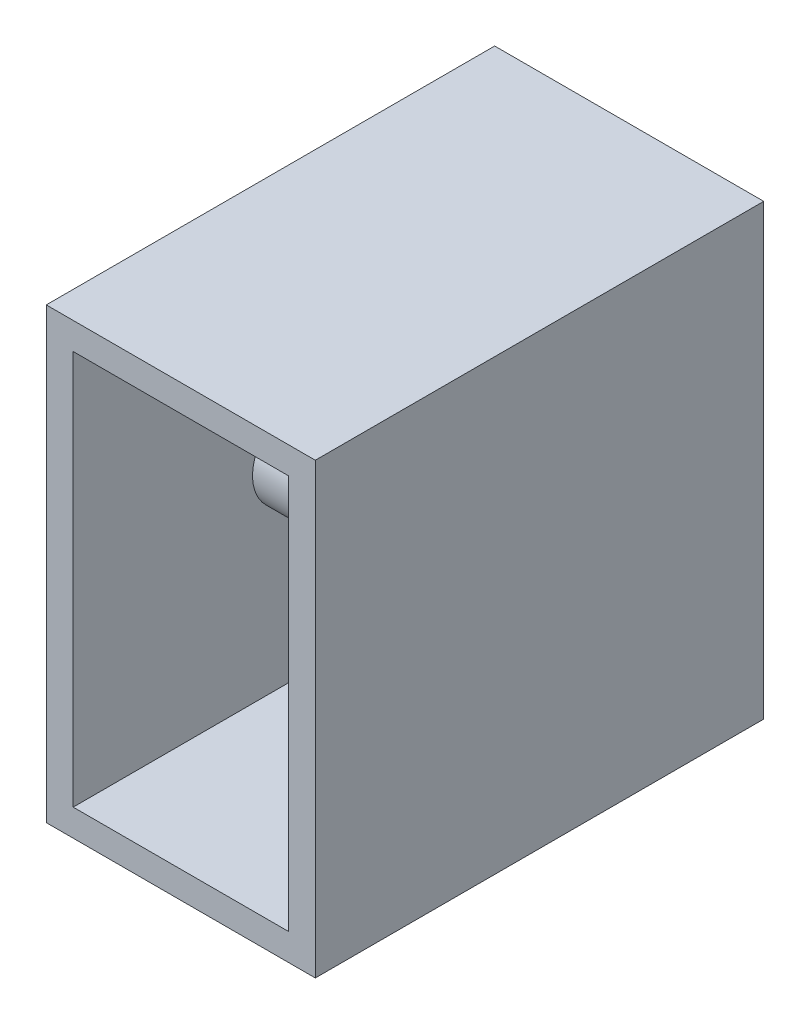
ISO-10303-21;
HEADER;
FILE_DESCRIPTION(('STEP AP214'),'2;1');
FILE_NAME('part.step','',(''),(''),'','','');
FILE_SCHEMA(('AUTOMOTIVE_DESIGN { 1 0 10303 214 1 1 1 1 }'));
ENDSEC;
DATA;
#1=APPLICATION_CONTEXT('core data for automotive mechanical design processes');
#2=APPLICATION_PROTOCOL_DEFINITION('international standard','automotive_design',2000,#1);
#3=PRODUCT_CONTEXT('',#1,'mechanical');
#4=PRODUCT('Part','Part','',(#3));
#5=PRODUCT_RELATED_PRODUCT_CATEGORY('part','',(#4));
#6=PRODUCT_DEFINITION_FORMATION('','',#4);
#7=PRODUCT_DEFINITION_CONTEXT('part definition',#1,'design');
#8=PRODUCT_DEFINITION('design','',#6,#7);
#9=PRODUCT_DEFINITION_SHAPE('','',#8);
#10=(LENGTH_UNIT() NAMED_UNIT(*) SI_UNIT(.MILLI.,.METRE.));
#11=(NAMED_UNIT(*) PLANE_ANGLE_UNIT() SI_UNIT($,.RADIAN.));
#12=(NAMED_UNIT(*) SI_UNIT($,.STERADIAN.) SOLID_ANGLE_UNIT());
#13=UNCERTAINTY_MEASURE_WITH_UNIT(LENGTH_MEASURE(1.E-05),#10,'distance_accuracy_value','');
#14=(GEOMETRIC_REPRESENTATION_CONTEXT(3) GLOBAL_UNCERTAINTY_ASSIGNED_CONTEXT((#13)) GLOBAL_UNIT_ASSIGNED_CONTEXT((#10,
#11,#12)) REPRESENTATION_CONTEXT('',''));
#15=CARTESIAN_POINT('',(0.,0.,0.));
#16=DIRECTION('',(0.,0.,1.));
#17=DIRECTION('',(1.,0.,0.));
#18=AXIS2_PLACEMENT_3D('',#15,#16,#17);
#19=CARTESIAN_POINT('',(0.,0.,50.));
#20=DIRECTION('',(0.,0.,1.));
#21=DIRECTION('',(1.,0.,0.));
#22=AXIS2_PLACEMENT_3D('',#19,#20,#21);
#23=PLANE('',#22);
#24=DIRECTION('',(0.,-1.,0.));
#25=VECTOR('',#24,1.);
#26=CARTESIAN_POINT('',(0.,0.,50.));
#27=LINE('',#26,#25);
#28=CARTESIAN_POINT('',(0.,50.,50.));
#29=VERTEX_POINT('',#28);
#30=CARTESIAN_POINT('',(0.,0.,50.));
#31=VERTEX_POINT('',#30);
#32=EDGE_CURVE('E182',#29,#31,#27,.T.);
#33=ORIENTED_EDGE('',*,*,#32,.T.);
#34=DIRECTION('',(1.,0.,0.));
#35=VECTOR('',#34,1.);
#36=CARTESIAN_POINT('',(0.,0.,50.));
#37=LINE('',#36,#35);
#38=CARTESIAN_POINT('',(30.,0.,50.));
#39=VERTEX_POINT('',#38);
#40=EDGE_CURVE('E186',#31,#39,#37,.T.);
#41=ORIENTED_EDGE('',*,*,#40,.T.);
#42=DIRECTION('',(0.,1.,0.));
#43=VECTOR('',#42,1.);
#44=CARTESIAN_POINT('',(30.,0.,50.));
#45=LINE('',#44,#43);
#46=CARTESIAN_POINT('',(30.,50.,50.));
#47=VERTEX_POINT('',#46);
#48=EDGE_CURVE('E190',#39,#47,#45,.T.);
#49=ORIENTED_EDGE('',*,*,#48,.T.);
#50=DIRECTION('',(-1.,0.,0.));
#51=VECTOR('',#50,1.);
#52=CARTESIAN_POINT('',(0.,50.,50.));
#53=LINE('',#52,#51);
#54=EDGE_CURVE('E193',#47,#29,#53,.T.);
#55=ORIENTED_EDGE('',*,*,#54,.T.);
#56=EDGE_LOOP('',(#33,#41,#49,#55));
#57=FACE_BOUND('',#56,.T.);
#58=DIRECTION('',(1.,0.,0.));
#59=VECTOR('',#58,1.);
#60=CARTESIAN_POINT('',(0.,3.,50.));
#61=LINE('',#60,#59);
#62=CARTESIAN_POINT('',(3.,3.,50.));
#63=VERTEX_POINT('',#62);
#64=CARTESIAN_POINT('',(27.,3.,50.));
#65=VERTEX_POINT('',#64);
#66=EDGE_CURVE('E143',#63,#65,#61,.T.);
#67=ORIENTED_EDGE('',*,*,#66,.F.);
#68=DIRECTION('',(0.,-1.,0.));
#69=VECTOR('',#68,1.);
#70=CARTESIAN_POINT('',(3.,0.,50.));
#71=LINE('',#70,#69);
#72=CARTESIAN_POINT('',(3.,47.,50.));
#73=VERTEX_POINT('',#72);
#74=EDGE_CURVE('E134',#73,#63,#71,.T.);
#75=ORIENTED_EDGE('',*,*,#74,.F.);
#76=DIRECTION('',(-1.,0.,0.));
#77=VECTOR('',#76,1.);
#78=CARTESIAN_POINT('',(0.,47.,50.));
#79=LINE('',#78,#77);
#80=CARTESIAN_POINT('',(27.,47.,50.));
#81=VERTEX_POINT('',#80);
#82=EDGE_CURVE('E160',#81,#73,#79,.T.);
#83=ORIENTED_EDGE('',*,*,#82,.F.);
#84=DIRECTION('',(0.,1.,0.));
#85=VECTOR('',#84,1.);
#86=CARTESIAN_POINT('',(27.,0.,50.));
#87=LINE('',#86,#85);
#88=EDGE_CURVE('E156',#65,#81,#87,.T.);
#89=ORIENTED_EDGE('',*,*,#88,.F.);
#90=EDGE_LOOP('',(#67,#75,#83,#89));
#91=FACE_BOUND('',#90,.T.);
#92=ADVANCED_FACE('F67',(#57,#91),#23,.T.);
#93=CARTESIAN_POINT('',(0.,0.,0.));
#94=DIRECTION('',(0.,0.,1.));
#95=DIRECTION('',(1.,0.,0.));
#96=AXIS2_PLACEMENT_3D('',#93,#94,#95);
#97=PLANE('',#96);
#98=DIRECTION('',(0.,-1.,0.));
#99=VECTOR('',#98,1.);
#100=CARTESIAN_POINT('',(0.,0.,0.));
#101=LINE('',#100,#99);
#102=CARTESIAN_POINT('',(0.,50.,0.));
#103=VERTEX_POINT('',#102);
#104=CARTESIAN_POINT('',(0.,0.,0.));
#105=VERTEX_POINT('',#104);
#106=EDGE_CURVE('E152',#103,#105,#101,.T.);
#107=ORIENTED_EDGE('',*,*,#106,.F.);
#108=DIRECTION('',(-1.,0.,0.));
#109=VECTOR('',#108,1.);
#110=CARTESIAN_POINT('',(0.,50.,0.));
#111=LINE('',#110,#109);
#112=CARTESIAN_POINT('',(30.,50.,0.));
#113=VERTEX_POINT('',#112);
#114=EDGE_CURVE('E187',#113,#103,#111,.T.);
#115=ORIENTED_EDGE('',*,*,#114,.F.);
#116=DIRECTION('',(0.,1.,0.));
#117=VECTOR('',#116,1.);
#118=CARTESIAN_POINT('',(30.,0.,0.));
#119=LINE('',#118,#117);
#120=CARTESIAN_POINT('',(30.,0.,0.));
#121=VERTEX_POINT('',#120);
#122=EDGE_CURVE('E203',#121,#113,#119,.T.);
#123=ORIENTED_EDGE('',*,*,#122,.F.);
#124=DIRECTION('',(1.,0.,0.));
#125=VECTOR('',#124,1.);
#126=CARTESIAN_POINT('',(0.,0.,0.));
#127=LINE('',#126,#125);
#128=EDGE_CURVE('E200',#105,#121,#127,.T.);
#129=ORIENTED_EDGE('',*,*,#128,.F.);
#130=EDGE_LOOP('',(#107,#115,#123,#129));
#131=FACE_BOUND('',#130,.T.);
#132=DIRECTION('',(0.,-1.,0.));
#133=VECTOR('',#132,1.);
#134=CARTESIAN_POINT('',(3.,0.,0.));
#135=LINE('',#134,#133);
#136=CARTESIAN_POINT('',(3.,47.,0.));
#137=VERTEX_POINT('',#136);
#138=CARTESIAN_POINT('',(3.,3.,0.));
#139=VERTEX_POINT('',#138);
#140=EDGE_CURVE('E92',#137,#139,#135,.T.);
#141=ORIENTED_EDGE('',*,*,#140,.T.);
#142=DIRECTION('',(1.,0.,0.));
#143=VECTOR('',#142,1.);
#144=CARTESIAN_POINT('',(0.,3.,0.));
#145=LINE('',#144,#143);
#146=CARTESIAN_POINT('',(27.,3.,0.));
#147=VERTEX_POINT('',#146);
#148=EDGE_CURVE('E150',#139,#147,#145,.T.);
#149=ORIENTED_EDGE('',*,*,#148,.T.);
#150=DIRECTION('',(0.,1.,0.));
#151=VECTOR('',#150,1.);
#152=CARTESIAN_POINT('',(27.,0.,0.));
#153=LINE('',#152,#151);
#154=CARTESIAN_POINT('',(27.,47.,0.));
#155=VERTEX_POINT('',#154);
#156=EDGE_CURVE('E169',#147,#155,#153,.T.);
#157=ORIENTED_EDGE('',*,*,#156,.T.);
#158=DIRECTION('',(-1.,0.,0.));
#159=VECTOR('',#158,1.);
#160=CARTESIAN_POINT('',(0.,47.,0.));
#161=LINE('',#160,#159);
#162=EDGE_CURVE('E144',#155,#137,#161,.T.);
#163=ORIENTED_EDGE('',*,*,#162,.T.);
#164=EDGE_LOOP('',(#141,#149,#157,#163));
#165=FACE_BOUND('',#164,.T.);
#166=ADVANCED_FACE('F236',(#131,#165),#97,.F.);
#167=CARTESIAN_POINT('',(0.,0.,50.));
#168=DIRECTION('',(1.,0.,0.));
#169=DIRECTION('',(0.,0.,-1.));
#170=AXIS2_PLACEMENT_3D('',#167,#168,#169);
#171=PLANE('',#170);
#172=ORIENTED_EDGE('',*,*,#106,.T.);
#173=DIRECTION('',(0.,0.,-1.));
#174=VECTOR('',#173,1.);
#175=CARTESIAN_POINT('',(0.,0.,50.));
#176=LINE('',#175,#174);
#177=EDGE_CURVE('E218',#31,#105,#176,.T.);
#178=ORIENTED_EDGE('',*,*,#177,.F.);
#179=ORIENTED_EDGE('',*,*,#32,.F.);
#180=DIRECTION('',(0.,0.,-1.));
#181=VECTOR('',#180,1.);
#182=CARTESIAN_POINT('',(0.,50.,50.));
#183=LINE('',#182,#181);
#184=EDGE_CURVE('E196',#29,#103,#183,.T.);
#185=ORIENTED_EDGE('',*,*,#184,.T.);
#186=EDGE_LOOP('',(#172,#178,#179,#185));
#187=FACE_BOUND('',#186,.T.);
#188=ADVANCED_FACE('F69',(#187),#171,.F.);
#189=CARTESIAN_POINT('',(0.,0.,50.));
#190=DIRECTION('',(0.,1.,0.));
#191=DIRECTION('',(0.,0.,1.));
#192=AXIS2_PLACEMENT_3D('',#189,#190,#191);
#193=PLANE('',#192);
#194=ORIENTED_EDGE('',*,*,#128,.T.);
#195=DIRECTION('',(0.,0.,-1.));
#196=VECTOR('',#195,1.);
#197=CARTESIAN_POINT('',(30.,0.,50.));
#198=LINE('',#197,#196);
#199=EDGE_CURVE('E215',#39,#121,#198,.T.);
#200=ORIENTED_EDGE('',*,*,#199,.F.);
#201=ORIENTED_EDGE('',*,*,#40,.F.);
#202=ORIENTED_EDGE('',*,*,#177,.T.);
#203=EDGE_LOOP('',(#194,#200,#201,#202));
#204=FACE_BOUND('',#203,.T.);
#205=ADVANCED_FACE('F261',(#204),#193,.F.);
#206=CARTESIAN_POINT('',(30.,0.,50.));
#207=DIRECTION('',(-1.,0.,0.));
#208=DIRECTION('',(0.,0.,1.));
#209=AXIS2_PLACEMENT_3D('',#206,#207,#208);
#210=PLANE('',#209);
#211=ORIENTED_EDGE('',*,*,#122,.T.);
#212=DIRECTION('',(0.,0.,-1.));
#213=VECTOR('',#212,1.);
#214=CARTESIAN_POINT('',(30.,50.,50.));
#215=LINE('',#214,#213);
#216=EDGE_CURVE('E211',#47,#113,#215,.T.);
#217=ORIENTED_EDGE('',*,*,#216,.F.);
#218=ORIENTED_EDGE('',*,*,#48,.F.);
#219=ORIENTED_EDGE('',*,*,#199,.T.);
#220=EDGE_LOOP('',(#211,#217,#218,#219));
#221=FACE_BOUND('',#220,.T.);
#222=ADVANCED_FACE('F258',(#221),#210,.F.);
#223=CARTESIAN_POINT('',(0.,50.,50.));
#224=DIRECTION('',(0.,-1.,0.));
#225=DIRECTION('',(0.,0.,-1.));
#226=AXIS2_PLACEMENT_3D('',#223,#224,#225);
#227=PLANE('',#226);
#228=ORIENTED_EDGE('',*,*,#114,.T.);
#229=ORIENTED_EDGE('',*,*,#184,.F.);
#230=ORIENTED_EDGE('',*,*,#54,.F.);
#231=ORIENTED_EDGE('',*,*,#216,.T.);
#232=EDGE_LOOP('',(#228,#229,#230,#231));
#233=FACE_BOUND('',#232,.T.);
#234=ADVANCED_FACE('F255',(#233),#227,.F.);
#235=CARTESIAN_POINT('',(3.,0.,50.));
#236=DIRECTION('',(1.,0.,0.));
#237=DIRECTION('',(0.,0.,-1.));
#238=AXIS2_PLACEMENT_3D('',#235,#236,#237);
#239=PLANE('',#238);
#240=CARTESIAN_POINT('',(3.,25.,25.));
#241=DIRECTION('',(1.,0.,0.));
#242=DIRECTION('',(0.,0.,-1.));
#243=AXIS2_PLACEMENT_3D('',#240,#241,#242);
#244=CIRCLE('',#243,5.);
#245=CARTESIAN_POINT('',(3.,25.,20.));
#246=VERTEX_POINT('',#245);
#247=EDGE_CURVE('E12',#246,#246,#244,.T.);
#248=ORIENTED_EDGE('',*,*,#247,.F.);
#249=EDGE_LOOP('',(#248));
#250=FACE_BOUND('',#249,.T.);
#251=ORIENTED_EDGE('',*,*,#140,.F.);
#252=DIRECTION('',(0.,0.,-1.));
#253=VECTOR('',#252,1.);
#254=CARTESIAN_POINT('',(3.,47.,50.));
#255=LINE('',#254,#253);
#256=EDGE_CURVE('E138',#73,#137,#255,.T.);
#257=ORIENTED_EDGE('',*,*,#256,.F.);
#258=ORIENTED_EDGE('',*,*,#74,.T.);
#259=DIRECTION('',(0.,0.,-1.));
#260=VECTOR('',#259,1.);
#261=CARTESIAN_POINT('',(3.,3.,50.));
#262=LINE('',#261,#260);
#263=EDGE_CURVE('E137',#63,#139,#262,.T.);
#264=ORIENTED_EDGE('',*,*,#263,.T.);
#265=EDGE_LOOP('',(#251,#257,#258,#264));
#266=FACE_BOUND('',#265,.T.);
#267=ADVANCED_FACE('F136',(#250,#266),#239,.T.);
#268=CARTESIAN_POINT('',(0.,3.,50.));
#269=DIRECTION('',(0.,1.,0.));
#270=DIRECTION('',(0.,0.,1.));
#271=AXIS2_PLACEMENT_3D('',#268,#269,#270);
#272=PLANE('',#271);
#273=ORIENTED_EDGE('',*,*,#148,.F.);
#274=ORIENTED_EDGE('',*,*,#263,.F.);
#275=ORIENTED_EDGE('',*,*,#66,.T.);
#276=DIRECTION('',(0.,0.,-1.));
#277=VECTOR('',#276,1.);
#278=CARTESIAN_POINT('',(27.,3.,50.));
#279=LINE('',#278,#277);
#280=EDGE_CURVE('E153',#65,#147,#279,.T.);
#281=ORIENTED_EDGE('',*,*,#280,.T.);
#282=EDGE_LOOP('',(#273,#274,#275,#281));
#283=FACE_BOUND('',#282,.T.);
#284=ADVANCED_FACE('F147',(#283),#272,.T.);
#285=CARTESIAN_POINT('',(27.,0.,50.));
#286=DIRECTION('',(-1.,0.,0.));
#287=DIRECTION('',(0.,0.,1.));
#288=AXIS2_PLACEMENT_3D('',#285,#286,#287);
#289=PLANE('',#288);
#290=CARTESIAN_POINT('',(27.,25.,25.));
#291=DIRECTION('',(-1.,0.,0.));
#292=DIRECTION('',(0.,0.,1.));
#293=AXIS2_PLACEMENT_3D('',#290,#291,#292);
#294=CIRCLE('',#293,5.);
#295=CARTESIAN_POINT('',(27.,25.,30.));
#296=VERTEX_POINT('',#295);
#297=EDGE_CURVE('E71',#296,#296,#294,.T.);
#298=ORIENTED_EDGE('',*,*,#297,.F.);
#299=EDGE_LOOP('',(#298));
#300=FACE_BOUND('',#299,.T.);
#301=ORIENTED_EDGE('',*,*,#156,.F.);
#302=ORIENTED_EDGE('',*,*,#280,.F.);
#303=ORIENTED_EDGE('',*,*,#88,.T.);
#304=DIRECTION('',(0.,0.,-1.));
#305=VECTOR('',#304,1.);
#306=CARTESIAN_POINT('',(27.,47.,50.));
#307=LINE('',#306,#305);
#308=EDGE_CURVE('E84',#81,#155,#307,.T.);
#309=ORIENTED_EDGE('',*,*,#308,.T.);
#310=EDGE_LOOP('',(#301,#302,#303,#309));
#311=FACE_BOUND('',#310,.T.);
#312=ADVANCED_FACE('F229',(#300,#311),#289,.T.);
#313=CARTESIAN_POINT('',(0.,47.,50.));
#314=DIRECTION('',(0.,-1.,0.));
#315=DIRECTION('',(0.,0.,-1.));
#316=AXIS2_PLACEMENT_3D('',#313,#314,#315);
#317=PLANE('',#316);
#318=ORIENTED_EDGE('',*,*,#162,.F.);
#319=ORIENTED_EDGE('',*,*,#308,.F.);
#320=ORIENTED_EDGE('',*,*,#82,.T.);
#321=ORIENTED_EDGE('',*,*,#256,.T.);
#322=EDGE_LOOP('',(#318,#319,#320,#321));
#323=FACE_BOUND('',#322,.T.);
#324=ADVANCED_FACE('F232',(#323),#317,.T.);
#325=CARTESIAN_POINT('',(0.,25.,25.));
#326=DIRECTION('',(1.,0.,0.));
#327=DIRECTION('',(0.,0.,-1.));
#328=AXIS2_PLACEMENT_3D('',#325,#326,#327);
#329=CYLINDRICAL_SURFACE('',#328,5.);
#330=ORIENTED_EDGE('',*,*,#247,.T.);
#331=EDGE_LOOP('',(#330));
#332=FACE_BOUND('',#331,.T.);
#333=ORIENTED_EDGE('',*,*,#297,.T.);
#334=EDGE_LOOP('',(#333));
#335=FACE_BOUND('',#334,.T.);
#336=ADVANCED_FACE('F227',(#332,#335),#329,.T.);
#337=CLOSED_SHELL('',(#92,#166,#188,#205,#222,#234,#267,#284,#312,#324,#336));
#338=MANIFOLD_SOLID_BREP('B2',#337);
#339=ADVANCED_BREP_SHAPE_REPRESENTATION('',(#18,#338),#14);
#340=SHAPE_DEFINITION_REPRESENTATION(#9,#339);
ENDSEC;
END-ISO-10303-21;
